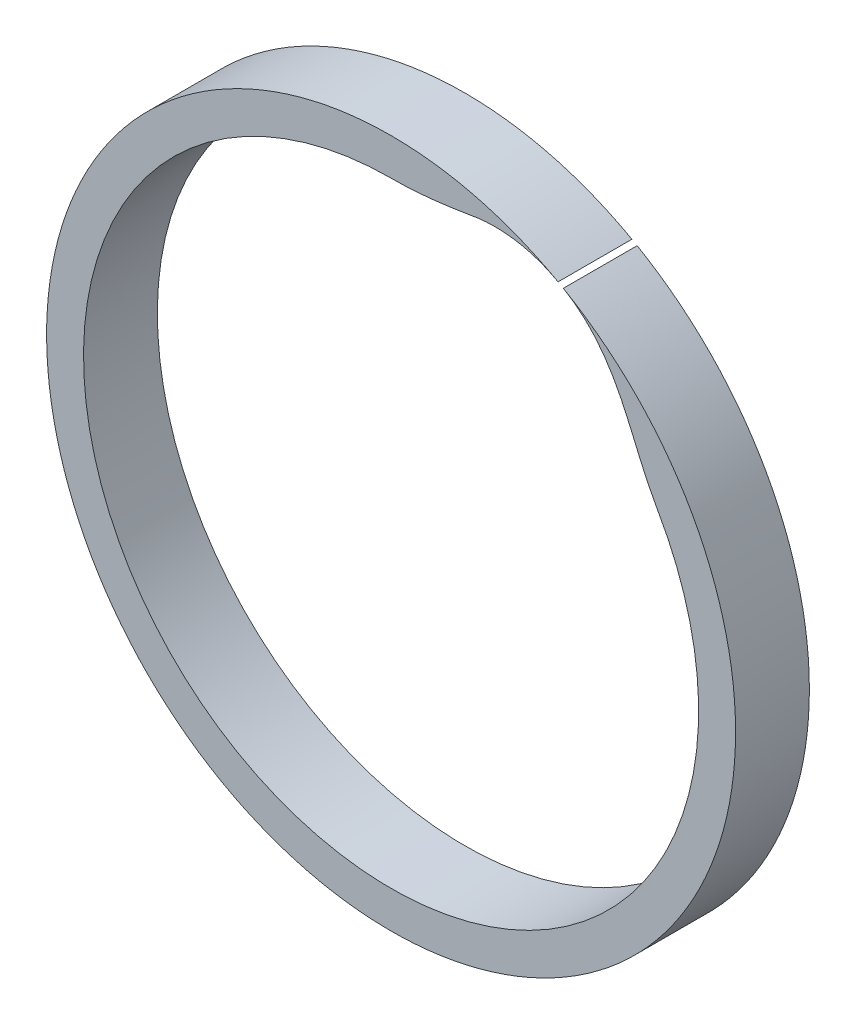
ISO-10303-21;
HEADER;
FILE_DESCRIPTION(('STEP AP214'),'2;1');
FILE_NAME('part.step','',(''),(''),'','','');
FILE_SCHEMA(('AUTOMOTIVE_DESIGN { 1 0 10303 214 1 1 1 1 }'));
ENDSEC;
DATA;
#1=APPLICATION_CONTEXT('core data for automotive mechanical design processes');
#2=APPLICATION_PROTOCOL_DEFINITION('international standard','automotive_design',2000,#1);
#3=PRODUCT_CONTEXT('',#1,'mechanical');
#4=PRODUCT('Part','Part','',(#3));
#5=PRODUCT_RELATED_PRODUCT_CATEGORY('part','',(#4));
#6=PRODUCT_DEFINITION_FORMATION('','',#4);
#7=PRODUCT_DEFINITION_CONTEXT('part definition',#1,'design');
#8=PRODUCT_DEFINITION('design','',#6,#7);
#9=PRODUCT_DEFINITION_SHAPE('','',#8);
#10=(LENGTH_UNIT() NAMED_UNIT(*) SI_UNIT(.MILLI.,.METRE.));
#11=(NAMED_UNIT(*) PLANE_ANGLE_UNIT() SI_UNIT($,.RADIAN.));
#12=(NAMED_UNIT(*) SI_UNIT($,.STERADIAN.) SOLID_ANGLE_UNIT());
#13=UNCERTAINTY_MEASURE_WITH_UNIT(LENGTH_MEASURE(1.E-05),#10,'distance_accuracy_value','');
#14=(GEOMETRIC_REPRESENTATION_CONTEXT(3) GLOBAL_UNCERTAINTY_ASSIGNED_CONTEXT((#13)) GLOBAL_UNIT_ASSIGNED_CONTEXT((#10,
#11,#12)) REPRESENTATION_CONTEXT('',''));
#15=CARTESIAN_POINT('',(0.,0.,0.));
#16=DIRECTION('',(0.,0.,1.));
#17=DIRECTION('',(1.,0.,0.));
#18=AXIS2_PLACEMENT_3D('',#15,#16,#17);
#19=CARTESIAN_POINT('',(0.,50.,12.));
#20=CARTESIAN_POINT('',(0.58241298871003,49.9999840853009,12.));
#21=CARTESIAN_POINT('',(1.45721700020076,50.013408168937,12.));
#22=CARTESIAN_POINT('',(2.62503663390206,50.0576309726251,12.));
#23=CARTESIAN_POINT('',(3.5057579264363,50.103957682923,12.));
#24=CARTESIAN_POINT('',(4.39136467459545,50.1632332466096,12.));
#25=CARTESIAN_POINT('',(5.28306825570898,50.2352416733546,12.));
#26=CARTESIAN_POINT('',(6.18207324004255,50.3197205153003,12.));
#27=CARTESIAN_POINT('',(7.08957615171457,50.4163594899872,12.));
#28=CARTESIAN_POINT('',(8.00676365147807,50.5248040629924,12.));
#29=CARTESIAN_POINT('',(8.93481260315407,50.6446443380771,12.));
#30=CARTESIAN_POINT('',(9.87488297951104,50.7754589377464,12.));
#31=CARTESIAN_POINT('',(10.8281380171661,50.9166496467413,12.));
#32=CARTESIAN_POINT('',(11.7956603193339,51.0680750382318,12.));
#33=CARTESIAN_POINT('',(12.7777955713682,51.2274718006915,12.));
#34=CARTESIAN_POINT('',(13.7680675591629,51.3988270995204,12.));
#35=CARTESIAN_POINT('',(14.7688077950961,51.520008157405,12.));
#36=CARTESIAN_POINT('',(15.7702868670565,51.5958505193626,12.));
#37=CARTESIAN_POINT('',(16.7701277624936,51.6248356151146,12.));
#38=CARTESIAN_POINT('',(17.7664433957547,51.6076386467499,12.));
#39=CARTESIAN_POINT('',(18.7574800907723,51.5444526711837,12.));
#40=CARTESIAN_POINT('',(19.7414645697322,51.4356703504703,12.));
#41=CARTESIAN_POINT('',(20.7166466871899,51.2817018103696,12.));
#42=CARTESIAN_POINT('',(21.6812900049662,51.0830226280145,12.));
#43=CARTESIAN_POINT('',(22.6336762261741,50.8401603652569,12.));
#44=CARTESIAN_POINT('',(23.5721060205727,50.553697668852,12.));
#45=CARTESIAN_POINT('',(24.4949004030919,50.224270060406,12.));
#46=CARTESIAN_POINT('',(25.7018927554646,49.728809228606,12.));
#47=CARTESIAN_POINT('',(26.5793213998233,49.2946857416638,12.));
#48=CARTESIAN_POINT('',(27.1493387337949,48.9787035998062,12.));
#49=B_SPLINE_CURVE_WITH_KNOTS('',3,(#19,#20,#21,#22,#23,#24,#25,#26,#27,#28,#29,#30,#31,#32,#33,
#34,#35,#36,#37,#38,#39,#40,#41,#42,#43,#44,#45,#46,#47,#48),.UNSPECIFIED.,.F.,.F.,(4,1,1,1,1,1,
1,1,1,1,1,1,1,1,1,1,1,1,1,1,1,1,1,1,1,1,1,4),(0.,0.0630889830031012,0.0947623279723039,
0.126589681309867,0.158621368671345,0.190906880409837,0.223494699337921,0.256432150084577,
0.289765271901543,0.323538715795797,0.357795665957718,0.392577784666812,0.427925179219334,
0.463876388948084,0.500361910250793,0.536773824786764,0.573023127969184,0.609123022155078,
0.645086550485189,0.680926607177144,0.716655948555819,0.75228720477136,0.787832892150476,
0.823305426122134,0.858717134654802,0.894080272138816,0.929407033644397,1.),.UNSPECIFIED.);
#50=DIRECTION('',(0.,0.,-1.));
#51=VECTOR('',#50,1.);
#52=SURFACE_OF_LINEAR_EXTRUSION('',#49,#51);
#53=CARTESIAN_POINT('',(0.,50.,0.));
#54=CARTESIAN_POINT('',(0.58241298871003,49.9999840853009,0.));
#55=CARTESIAN_POINT('',(1.45721700020076,50.013408168937,0.));
#56=CARTESIAN_POINT('',(2.62503663390206,50.0576309726251,0.));
#57=CARTESIAN_POINT('',(3.5057579264363,50.103957682923,0.));
#58=CARTESIAN_POINT('',(4.39136467459545,50.1632332466096,0.));
#59=CARTESIAN_POINT('',(5.28306825570898,50.2352416733546,0.));
#60=CARTESIAN_POINT('',(6.18207324004255,50.3197205153003,0.));
#61=CARTESIAN_POINT('',(7.08957615171457,50.4163594899872,0.));
#62=CARTESIAN_POINT('',(8.00676365147807,50.5248040629924,0.));
#63=CARTESIAN_POINT('',(8.93481260315407,50.6446443380771,0.));
#64=CARTESIAN_POINT('',(9.87488297951104,50.7754589377464,0.));
#65=CARTESIAN_POINT('',(10.8281380171661,50.9166496467413,0.));
#66=CARTESIAN_POINT('',(11.7956603193339,51.0680750382318,0.));
#67=CARTESIAN_POINT('',(12.7777955713682,51.2274718006915,0.));
#68=CARTESIAN_POINT('',(13.7680675591629,51.3988270995204,0.));
#69=CARTESIAN_POINT('',(14.7688077950961,51.520008157405,0.));
#70=CARTESIAN_POINT('',(15.7702868670565,51.5958505193626,0.));
#71=CARTESIAN_POINT('',(16.7701277624936,51.6248356151146,0.));
#72=CARTESIAN_POINT('',(17.7664433957547,51.6076386467499,0.));
#73=CARTESIAN_POINT('',(18.7574800907723,51.5444526711837,0.));
#74=CARTESIAN_POINT('',(19.7414645697322,51.4356703504703,0.));
#75=CARTESIAN_POINT('',(20.7166466871899,51.2817018103696,0.));
#76=CARTESIAN_POINT('',(21.6812900049662,51.0830226280145,0.));
#77=CARTESIAN_POINT('',(22.6336762261741,50.8401603652569,0.));
#78=CARTESIAN_POINT('',(23.5721060205727,50.553697668852,0.));
#79=CARTESIAN_POINT('',(24.4949004030919,50.224270060406,0.));
#80=CARTESIAN_POINT('',(25.7018927554646,49.728809228606,0.));
#81=CARTESIAN_POINT('',(26.5793213998233,49.2946857416638,0.));
#82=CARTESIAN_POINT('',(27.1493387337949,48.9787035998062,0.));
#83=B_SPLINE_CURVE_WITH_KNOTS('',3,(#53,#54,#55,#56,#57,#58,#59,#60,#61,#62,#63,#64,#65,#66,#67,
#68,#69,#70,#71,#72,#73,#74,#75,#76,#77,#78,#79,#80,#81,#82),.UNSPECIFIED.,.F.,.F.,(4,1,1,1,1,1,
1,1,1,1,1,1,1,1,1,1,1,1,1,1,1,1,1,1,1,1,1,4),(0.,0.0630889830031012,0.0947623279723039,
0.126589681309867,0.158621368671345,0.190906880409837,0.223494699337921,0.256432150084577,
0.289765271901543,0.323538715795797,0.357795665957718,0.392577784666812,0.427925179219334,
0.463876388948084,0.500361910250793,0.536773824786764,0.573023127969184,0.609123022155078,
0.645086550485189,0.680926607177144,0.716655948555819,0.75228720477136,0.787832892150476,
0.823305426122134,0.858717134654802,0.894080272138816,0.929407033644397,1.),.UNSPECIFIED.);
#84=CARTESIAN_POINT('',(0.,50.,0.));
#85=VERTEX_POINT('',#84);
#86=CARTESIAN_POINT('',(27.1493387337949,48.9787035998062,0.));
#87=VERTEX_POINT('',#86);
#88=EDGE_CURVE('E124',#85,#87,#83,.T.);
#89=ORIENTED_EDGE('',*,*,#88,.T.);
#90=DIRECTION('',(0.,0.,-1.));
#91=VECTOR('',#90,1.);
#92=CARTESIAN_POINT('',(27.1493387337949,48.9787035998062,12.));
#93=LINE('',#92,#91);
#94=CARTESIAN_POINT('',(27.1493387337949,48.9787035998062,12.));
#95=VERTEX_POINT('',#94);
#96=EDGE_CURVE('E11',#95,#87,#93,.T.);
#97=ORIENTED_EDGE('',*,*,#96,.F.);
#98=CARTESIAN_POINT('',(0.,50.,12.));
#99=VERTEX_POINT('',#98);
#100=EDGE_CURVE('E93',#99,#95,#49,.T.);
#101=ORIENTED_EDGE('',*,*,#100,.F.);
#102=DIRECTION('',(0.,0.,-1.));
#103=VECTOR('',#102,1.);
#104=CARTESIAN_POINT('',(0.,50.,12.));
#105=LINE('',#104,#103);
#106=EDGE_CURVE('E101',#99,#85,#105,.T.);
#107=ORIENTED_EDGE('',*,*,#106,.T.);
#108=EDGE_LOOP('',(#89,#97,#101,#107));
#109=FACE_BOUND('',#108,.T.);
#110=ADVANCED_FACE('F41',(#109),#52,.F.);
#111=CARTESIAN_POINT('',(0.,0.,12.));
#112=DIRECTION('',(0.,0.,-1.));
#113=DIRECTION('',(-1.,0.,0.));
#114=AXIS2_PLACEMENT_3D('',#111,#112,#113);
#115=CYLINDRICAL_SURFACE('',#114,56.);
#116=CARTESIAN_POINT('',(0.,0.,0.));
#117=DIRECTION('',(0.,0.,1.));
#118=DIRECTION('',(1.,0.,0.));
#119=AXIS2_PLACEMENT_3D('',#116,#117,#118);
#120=CIRCLE('',#119,56.);
#121=CARTESIAN_POINT('',(28.,48.4974226119286,0.));
#122=VERTEX_POINT('',#121);
#123=EDGE_CURVE('E97',#87,#122,#120,.T.);
#124=ORIENTED_EDGE('',*,*,#123,.T.);
#125=DIRECTION('',(0.,0.,-1.));
#126=VECTOR('',#125,1.);
#127=CARTESIAN_POINT('',(28.,48.4974226119286,12.));
#128=LINE('',#127,#126);
#129=CARTESIAN_POINT('',(28.,48.4974226119286,12.));
#130=VERTEX_POINT('',#129);
#131=EDGE_CURVE('E50',#130,#122,#128,.T.);
#132=ORIENTED_EDGE('',*,*,#131,.F.);
#133=CARTESIAN_POINT('',(0.,0.,12.));
#134=DIRECTION('',(0.,0.,1.));
#135=DIRECTION('',(1.,0.,0.));
#136=AXIS2_PLACEMENT_3D('',#133,#134,#135);
#137=CIRCLE('',#136,56.);
#138=EDGE_CURVE('E88',#95,#130,#137,.T.);
#139=ORIENTED_EDGE('',*,*,#138,.F.);
#140=ORIENTED_EDGE('',*,*,#96,.T.);
#141=EDGE_LOOP('',(#124,#132,#139,#140));
#142=FACE_BOUND('',#141,.T.);
#143=ADVANCED_FACE('F96',(#142),#115,.T.);
#144=CARTESIAN_POINT('',(28.,48.4974226119286,12.));
#145=CARTESIAN_POINT('',(28.5645359869365,48.1715600345303,12.));
#146=CARTESIAN_POINT('',(29.3864658952604,47.638946938731,12.));
#147=CARTESIAN_POINT('',(30.4252318291366,46.8484154800205,12.));
#148=CARTESIAN_POINT('',(31.1754117993019,46.2166049326083,12.));
#149=CARTESIAN_POINT('',(31.8955049239202,45.5483142425113,12.));
#150=CARTESIAN_POINT('',(32.5849630295111,44.8459959207021,12.));
#151=CARTESIAN_POINT('',(33.2435537892373,44.1123290696675,12.));
#152=CARTESIAN_POINT('',(33.8713694447076,43.3501833407283,12.));
#153=CARTESIAN_POINT('',(34.4688277971716,42.5625776812236,12.));
#154=CARTESIAN_POINT('',(35.0366691094845,41.7526387954773,12.));
#155=CARTESIAN_POINT('',(35.5759480575046,40.9235587172138,12.));
#156=CARTESIAN_POINT('',(36.0880211268613,40.0785523532602,12.));
#157=CARTESIAN_POINT('',(36.5745295574101,39.2208154555651,12.));
#158=CARTESIAN_POINT('',(37.0373780642092,38.3534835843333,12.));
#159=CARTESIAN_POINT('',(37.4787095839265,37.4795925954775,12.));
#160=CARTESIAN_POINT('',(37.9008763495969,36.6020411872916,12.));
#161=CARTESIAN_POINT('',(38.3064076436441,35.723556024759,12.));
#162=CARTESIAN_POINT('',(38.6979746255485,34.8466599350776,12.));
#163=CARTESIAN_POINT('',(39.0783526707978,33.9736436300566,12.));
#164=CARTESIAN_POINT('',(39.4503816890342,33.1065413588971,12.));
#165=CARTESIAN_POINT('',(39.8169249153385,32.2471108290363,12.));
#166=CARTESIAN_POINT('',(40.1808266748475,31.3968176443535,12.));
#167=CARTESIAN_POINT('',(40.5448696724879,30.556824427872,12.));
#168=CARTESIAN_POINT('',(40.9117322418327,29.7279846179538,12.));
#169=CARTESIAN_POINT('',(41.2839465246103,28.9108410486007,12.));
#170=CARTESIAN_POINT('',(41.663856748066,28.1056284361331,12.));
#171=CARTESIAN_POINT('',(42.0535836731255,27.3122820617444,12.));
#172=CARTESIAN_POINT('',(42.5878822391827,26.2715661365716,12.));
#173=CARTESIAN_POINT('',(43.0099224068909,25.5044981149949,12.));
#174=CARTESIAN_POINT('',(43.3012701892219,25.,12.));
#175=B_SPLINE_CURVE_WITH_KNOTS('',3,(#144,#145,#146,#147,#148,#149,#150,#151,#152,#153,#154,
#155,#156,#157,#158,#159,#160,#161,#162,#163,#164,#165,#166,#167,#168,#169,#170,#171,#172,#173,
#174),.UNSPECIFIED.,.F.,.F.,(4,1,1,1,1,1,1,1,1,1,1,1,1,1,1,1,1,1,1,1,1,1,1,1,1,1,1,1,4),(0.,
0.0685239899803135,0.102830464018905,0.137186327627108,0.171601635348724,0.206081397078729,
0.240624838552374,0.275224955064879,0.309868371921927,0.3445355099788,0.379201042023934,
0.413834616058608,0.448401814588256,0.482865314401023,0.517186208306559,0.551325448226998,
0.585245367197841,0.618911235683595,0.652292804740317,0.685365784785498,0.718113204181358,
0.750526587004835,0.782606885252895,0.814365098840738,0.845822519104107,0.877010540364073,
0.907970001427814,0.938750045623333,1.),.UNSPECIFIED.);
#176=DIRECTION('',(0.,0.,-1.));
#177=VECTOR('',#176,1.);
#178=SURFACE_OF_LINEAR_EXTRUSION('',#175,#177);
#179=CARTESIAN_POINT('',(28.,48.4974226119286,0.));
#180=CARTESIAN_POINT('',(28.5645359869365,48.1715600345303,0.));
#181=CARTESIAN_POINT('',(29.3864658952604,47.638946938731,0.));
#182=CARTESIAN_POINT('',(30.4252318291366,46.8484154800205,0.));
#183=CARTESIAN_POINT('',(31.1754117993019,46.2166049326083,0.));
#184=CARTESIAN_POINT('',(31.8955049239202,45.5483142425113,0.));
#185=CARTESIAN_POINT('',(32.5849630295111,44.8459959207021,0.));
#186=CARTESIAN_POINT('',(33.2435537892373,44.1123290696675,0.));
#187=CARTESIAN_POINT('',(33.8713694447076,43.3501833407283,0.));
#188=CARTESIAN_POINT('',(34.4688277971716,42.5625776812236,0.));
#189=CARTESIAN_POINT('',(35.0366691094845,41.7526387954773,0.));
#190=CARTESIAN_POINT('',(35.5759480575046,40.9235587172138,0.));
#191=CARTESIAN_POINT('',(36.0880211268613,40.0785523532602,0.));
#192=CARTESIAN_POINT('',(36.5745295574101,39.2208154555651,0.));
#193=CARTESIAN_POINT('',(37.0373780642092,38.3534835843333,0.));
#194=CARTESIAN_POINT('',(37.4787095839265,37.4795925954775,0.));
#195=CARTESIAN_POINT('',(37.9008763495969,36.6020411872916,0.));
#196=CARTESIAN_POINT('',(38.3064076436441,35.723556024759,0.));
#197=CARTESIAN_POINT('',(38.6979746255485,34.8466599350776,0.));
#198=CARTESIAN_POINT('',(39.0783526707978,33.9736436300566,0.));
#199=CARTESIAN_POINT('',(39.4503816890342,33.1065413588971,0.));
#200=CARTESIAN_POINT('',(39.8169249153385,32.2471108290363,0.));
#201=CARTESIAN_POINT('',(40.1808266748475,31.3968176443535,0.));
#202=CARTESIAN_POINT('',(40.5448696724879,30.556824427872,0.));
#203=CARTESIAN_POINT('',(40.9117322418327,29.7279846179538,0.));
#204=CARTESIAN_POINT('',(41.2839465246103,28.9108410486007,0.));
#205=CARTESIAN_POINT('',(41.663856748066,28.1056284361331,0.));
#206=CARTESIAN_POINT('',(42.0535836731255,27.3122820617444,0.));
#207=CARTESIAN_POINT('',(42.5878822391827,26.2715661365716,0.));
#208=CARTESIAN_POINT('',(43.0099224068909,25.5044981149949,0.));
#209=CARTESIAN_POINT('',(43.3012701892219,25.,0.));
#210=B_SPLINE_CURVE_WITH_KNOTS('',3,(#179,#180,#181,#182,#183,#184,#185,#186,#187,#188,#189,
#190,#191,#192,#193,#194,#195,#196,#197,#198,#199,#200,#201,#202,#203,#204,#205,#206,#207,#208,
#209),.UNSPECIFIED.,.F.,.F.,(4,1,1,1,1,1,1,1,1,1,1,1,1,1,1,1,1,1,1,1,1,1,1,1,1,1,1,1,4),(0.,
0.0685239899803135,0.102830464018905,0.137186327627108,0.171601635348724,0.206081397078729,
0.240624838552374,0.275224955064879,0.309868371921927,0.3445355099788,0.379201042023934,
0.413834616058608,0.448401814588256,0.482865314401023,0.517186208306559,0.551325448226998,
0.585245367197841,0.618911235683595,0.652292804740317,0.685365784785498,0.718113204181358,
0.750526587004835,0.782606885252895,0.814365098840738,0.845822519104107,0.877010540364073,
0.907970001427814,0.938750045623333,1.),.UNSPECIFIED.);
#211=CARTESIAN_POINT('',(43.3012701892219,25.,0.));
#212=VERTEX_POINT('',#211);
#213=EDGE_CURVE('E75',#122,#212,#210,.T.);
#214=ORIENTED_EDGE('',*,*,#213,.T.);
#215=DIRECTION('',(0.,0.,-1.));
#216=VECTOR('',#215,1.);
#217=CARTESIAN_POINT('',(43.3012701892219,25.,12.));
#218=LINE('',#217,#216);
#219=CARTESIAN_POINT('',(43.3012701892219,25.,12.));
#220=VERTEX_POINT('',#219);
#221=EDGE_CURVE('E98',#220,#212,#218,.T.);
#222=ORIENTED_EDGE('',*,*,#221,.F.);
#223=EDGE_CURVE('E91',#130,#220,#175,.T.);
#224=ORIENTED_EDGE('',*,*,#223,.F.);
#225=ORIENTED_EDGE('',*,*,#131,.T.);
#226=EDGE_LOOP('',(#214,#222,#224,#225));
#227=FACE_BOUND('',#226,.T.);
#228=ADVANCED_FACE('F99',(#227),#178,.F.);
#229=CARTESIAN_POINT('',(0.,0.,12.));
#230=DIRECTION('',(0.,0.,-1.));
#231=DIRECTION('',(-1.,0.,0.));
#232=AXIS2_PLACEMENT_3D('',#229,#230,#231);
#233=CYLINDRICAL_SURFACE('',#232,50.);
#234=CARTESIAN_POINT('',(0.,0.,0.));
#235=DIRECTION('',(0.,0.,-1.));
#236=DIRECTION('',(-1.,0.,0.));
#237=AXIS2_PLACEMENT_3D('',#234,#235,#236);
#238=CIRCLE('',#237,50.);
#239=EDGE_CURVE('E81',#212,#85,#238,.T.);
#240=ORIENTED_EDGE('',*,*,#239,.T.);
#241=ORIENTED_EDGE('',*,*,#106,.F.);
#242=CARTESIAN_POINT('',(0.,0.,12.));
#243=DIRECTION('',(0.,0.,-1.));
#244=DIRECTION('',(-1.,0.,0.));
#245=AXIS2_PLACEMENT_3D('',#242,#243,#244);
#246=CIRCLE('',#245,50.);
#247=EDGE_CURVE('E58',#220,#99,#246,.T.);
#248=ORIENTED_EDGE('',*,*,#247,.F.);
#249=ORIENTED_EDGE('',*,*,#221,.T.);
#250=EDGE_LOOP('',(#240,#241,#248,#249));
#251=FACE_BOUND('',#250,.T.);
#252=ADVANCED_FACE('F113',(#251),#233,.F.);
#253=CARTESIAN_POINT('',(13.7601190194227,51.3890103179892,12.));
#254=DIRECTION('',(0.,0.,-1.));
#255=DIRECTION('',(-1.,0.,0.));
#256=AXIS2_PLACEMENT_3D('',#253,#254,#255);
#257=PLANE('',#256);
#258=ORIENTED_EDGE('',*,*,#100,.T.);
#259=ORIENTED_EDGE('',*,*,#138,.T.);
#260=ORIENTED_EDGE('',*,*,#223,.T.);
#261=ORIENTED_EDGE('',*,*,#247,.T.);
#262=EDGE_LOOP('',(#258,#259,#260,#261));
#263=FACE_BOUND('',#262,.T.);
#264=ADVANCED_FACE('F89',(#263),#257,.F.);
#265=CARTESIAN_POINT('',(13.7601190194227,51.3890103179892,0.));
#266=DIRECTION('',(0.,0.,-1.));
#267=DIRECTION('',(-1.,0.,0.));
#268=AXIS2_PLACEMENT_3D('',#265,#266,#267);
#269=PLANE('',#268);
#270=ORIENTED_EDGE('',*,*,#88,.F.);
#271=ORIENTED_EDGE('',*,*,#239,.F.);
#272=ORIENTED_EDGE('',*,*,#213,.F.);
#273=ORIENTED_EDGE('',*,*,#123,.F.);
#274=EDGE_LOOP('',(#270,#271,#272,#273));
#275=FACE_BOUND('',#274,.T.);
#276=ADVANCED_FACE('F141',(#275),#269,.T.);
#277=CLOSED_SHELL('',(#110,#143,#228,#252,#264,#276));
#278=MANIFOLD_SOLID_BREP('B2',#277);
#279=ADVANCED_BREP_SHAPE_REPRESENTATION('',(#18,#278),#14);
#280=SHAPE_DEFINITION_REPRESENTATION(#9,#279);
ENDSEC;
END-ISO-10303-21;
